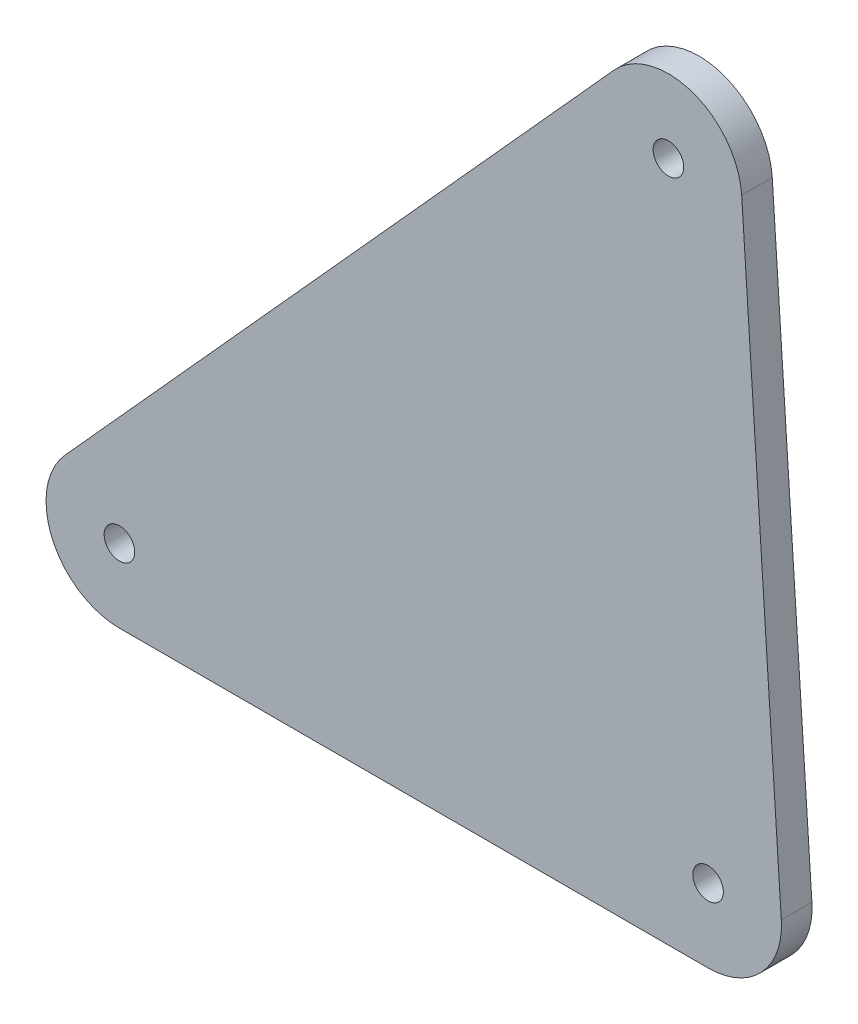
ISO-10303-21;
HEADER;
FILE_DESCRIPTION(('STEP AP214'),'2;1');
FILE_NAME('part.step','',(''),(''),'','','');
FILE_SCHEMA(('AUTOMOTIVE_DESIGN { 1 0 10303 214 1 1 1 1 }'));
ENDSEC;
DATA;
#1=APPLICATION_CONTEXT('core data for automotive mechanical design processes');
#2=APPLICATION_PROTOCOL_DEFINITION('international standard','automotive_design',2000,#1);
#3=PRODUCT_CONTEXT('',#1,'mechanical');
#4=PRODUCT('Part','Part','',(#3));
#5=PRODUCT_RELATED_PRODUCT_CATEGORY('part','',(#4));
#6=PRODUCT_DEFINITION_FORMATION('','',#4);
#7=PRODUCT_DEFINITION_CONTEXT('part definition',#1,'design');
#8=PRODUCT_DEFINITION('design','',#6,#7);
#9=PRODUCT_DEFINITION_SHAPE('','',#8);
#10=(LENGTH_UNIT() NAMED_UNIT(*) SI_UNIT(.MILLI.,.METRE.));
#11=(NAMED_UNIT(*) PLANE_ANGLE_UNIT() SI_UNIT($,.RADIAN.));
#12=(NAMED_UNIT(*) SI_UNIT($,.STERADIAN.) SOLID_ANGLE_UNIT());
#13=UNCERTAINTY_MEASURE_WITH_UNIT(LENGTH_MEASURE(1.E-05),#10,'distance_accuracy_value','');
#14=(GEOMETRIC_REPRESENTATION_CONTEXT(3) GLOBAL_UNCERTAINTY_ASSIGNED_CONTEXT((#13)) GLOBAL_UNIT_ASSIGNED_CONTEXT((#10,
#11,#12)) REPRESENTATION_CONTEXT('',''));
#15=CARTESIAN_POINT('',(0.,0.,0.));
#16=DIRECTION('',(0.,0.,1.));
#17=DIRECTION('',(1.,0.,0.));
#18=AXIS2_PLACEMENT_3D('',#15,#16,#17);
#19=CARTESIAN_POINT('',(96.2399998438047,-43.6944124892829,-23.206005243));
#20=DIRECTION('',(0.,0.,1.));
#21=DIRECTION('',(1.,0.,0.));
#22=AXIS2_PLACEMENT_3D('',#19,#20,#21);
#23=CYLINDRICAL_SURFACE('',#22,11.9999999885387);
#24=CARTESIAN_POINT('',(96.2399998438047,-43.6944124892829,-18.206005243));
#25=DIRECTION('',(0.,0.,1.));
#26=DIRECTION('',(1.,0.,0.));
#27=AXIS2_PLACEMENT_3D('',#24,#25,#26);
#28=CIRCLE('',#27,11.9999999885387);
#29=CARTESIAN_POINT('',(96.2399998438047,-55.6944124778216,-18.206005243));
#30=VERTEX_POINT('',#29);
#31=CARTESIAN_POINT('',(108.214557081093,-42.9134011604004,-18.206005243));
#32=VERTEX_POINT('',#31);
#33=EDGE_CURVE('E130',#30,#32,#28,.T.);
#34=ORIENTED_EDGE('',*,*,#33,.F.);
#35=DIRECTION('',(0.,0.,1.));
#36=VECTOR('',#35,1.);
#37=CARTESIAN_POINT('',(96.2399998438047,-55.6944124778216,-23.206005243));
#38=LINE('',#37,#36);
#39=CARTESIAN_POINT('',(96.2399998438047,-55.6944124778216,-23.206005243));
#40=VERTEX_POINT('',#39);
#41=EDGE_CURVE('E11',#40,#30,#38,.T.);
#42=ORIENTED_EDGE('',*,*,#41,.F.);
#43=CARTESIAN_POINT('',(96.2399998438047,-43.6944124892829,-23.206005243));
#44=DIRECTION('',(0.,0.,1.));
#45=DIRECTION('',(1.,0.,0.));
#46=AXIS2_PLACEMENT_3D('',#43,#44,#45);
#47=CIRCLE('',#46,11.9999999885387);
#48=CARTESIAN_POINT('',(108.214557081093,-42.9134011604004,-23.206005243));
#49=VERTEX_POINT('',#48);
#50=EDGE_CURVE('E151',#40,#49,#47,.T.);
#51=ORIENTED_EDGE('',*,*,#50,.T.);
#52=DIRECTION('',(0.,0.,1.));
#53=VECTOR('',#52,1.);
#54=CARTESIAN_POINT('',(108.214557081093,-42.9134011604004,-23.206005243));
#55=LINE('',#54,#53);
#56=EDGE_CURVE('E42',#49,#32,#55,.T.);
#57=ORIENTED_EDGE('',*,*,#56,.T.);
#58=EDGE_LOOP('',(#34,#42,#51,#57));
#59=FACE_BOUND('',#58,.T.);
#60=ADVANCED_FACE('F39',(#59),#23,.T.);
#61=CARTESIAN_POINT('',(0.,-55.6944124778216,-23.206005243));
#62=DIRECTION('',(0.,-1.,0.));
#63=DIRECTION('',(1.,0.,0.));
#64=AXIS2_PLACEMENT_3D('',#61,#62,#63);
#65=PLANE('',#64);
#66=DIRECTION('',(1.,0.,0.));
#67=VECTOR('',#66,1.);
#68=CARTESIAN_POINT('',(0.,-55.6944124778216,-18.206005243));
#69=LINE('',#68,#67);
#70=CARTESIAN_POINT('',(0.,-55.6944124778216,-18.206005243));
#71=VERTEX_POINT('',#70);
#72=EDGE_CURVE('E148',#71,#30,#69,.T.);
#73=ORIENTED_EDGE('',*,*,#72,.F.);
#74=DIRECTION('',(0.,0.,1.));
#75=VECTOR('',#74,1.);
#76=CARTESIAN_POINT('',(0.,-55.6944124778216,-23.206005243));
#77=LINE('',#76,#75);
#78=CARTESIAN_POINT('',(0.,-55.6944124778216,-23.206005243));
#79=VERTEX_POINT('',#78);
#80=EDGE_CURVE('E49',#79,#71,#77,.T.);
#81=ORIENTED_EDGE('',*,*,#80,.F.);
#82=DIRECTION('',(1.,0.,0.));
#83=VECTOR('',#82,1.);
#84=CARTESIAN_POINT('',(0.,-55.6944124778216,-23.206005243));
#85=LINE('',#84,#83);
#86=EDGE_CURVE('E116',#79,#40,#85,.T.);
#87=ORIENTED_EDGE('',*,*,#86,.T.);
#88=ORIENTED_EDGE('',*,*,#41,.T.);
#89=EDGE_LOOP('',(#73,#81,#87,#88));
#90=FACE_BOUND('',#89,.T.);
#91=ADVANCED_FACE('F163',(#90),#65,.T.);
#92=CARTESIAN_POINT('',(0.,-43.6944124817445,-23.206005243));
#93=DIRECTION('',(0.,0.,1.));
#94=DIRECTION('',(1.,0.,0.));
#95=AXIS2_PLACEMENT_3D('',#92,#93,#94);
#96=CYLINDRICAL_SURFACE('',#95,11.9999999960771);
#97=CARTESIAN_POINT('',(0.,-43.6944124817445,-18.206005243));
#98=DIRECTION('',(0.,0.,1.));
#99=DIRECTION('',(1.,0.,0.));
#100=AXIS2_PLACEMENT_3D('',#97,#98,#99);
#101=CIRCLE('',#100,11.9999999960771);
#102=CARTESIAN_POINT('',(-8.90580870191353,-35.6516162471771,-18.206005243));
#103=VERTEX_POINT('',#102);
#104=EDGE_CURVE('E102',#103,#71,#101,.T.);
#105=ORIENTED_EDGE('',*,*,#104,.F.);
#106=DIRECTION('',(0.,0.,1.));
#107=VECTOR('',#106,1.);
#108=CARTESIAN_POINT('',(-8.90580870191353,-35.6516162471771,-23.206005243));
#109=LINE('',#108,#107);
#110=CARTESIAN_POINT('',(-8.90580870191353,-35.6516162471771,-23.206005243));
#111=VERTEX_POINT('',#110);
#112=EDGE_CURVE('E97',#111,#103,#109,.T.);
#113=ORIENTED_EDGE('',*,*,#112,.F.);
#114=CARTESIAN_POINT('',(0.,-43.6944124817445,-23.206005243));
#115=DIRECTION('',(0.,0.,1.));
#116=DIRECTION('',(1.,0.,0.));
#117=AXIS2_PLACEMENT_3D('',#114,#115,#116);
#118=CIRCLE('',#117,11.9999999960771);
#119=EDGE_CURVE('E100',#111,#79,#118,.T.);
#120=ORIENTED_EDGE('',*,*,#119,.T.);
#121=ORIENTED_EDGE('',*,*,#80,.T.);
#122=EDGE_LOOP('',(#105,#113,#120,#121));
#123=FACE_BOUND('',#122,.T.);
#124=ADVANCED_FACE('F99',(#123),#96,.T.);
#125=CARTESIAN_POINT('',(80.8517971359318,63.7372087112362,-23.206005243));
#126=DIRECTION('',(-0.742150725402075,0.67023301976639,0.));
#127=DIRECTION('',(-0.67023301976639,-0.742150725402075,0.));
#128=AXIS2_PLACEMENT_3D('',#125,#126,#127);
#129=PLANE('',#128);
#130=DIRECTION('',(-0.67023301976639,-0.742150725402075,0.));
#131=VECTOR('',#130,1.);
#132=CARTESIAN_POINT('',(80.8517971359318,63.7372087112362,-18.206005243));
#133=LINE('',#132,#131);
#134=CARTESIAN_POINT('',(80.8517971359318,63.7372087112362,-18.206005243));
#135=VERTEX_POINT('',#134);
#136=EDGE_CURVE('E143',#135,#103,#133,.T.);
#137=ORIENTED_EDGE('',*,*,#136,.F.);
#138=DIRECTION('',(0.,0.,1.));
#139=VECTOR('',#138,1.);
#140=CARTESIAN_POINT('',(80.8517971359318,63.7372087112362,-23.206005243));
#141=LINE('',#140,#139);
#142=CARTESIAN_POINT('',(80.8517971359318,63.7372087112362,-23.206005243));
#143=VERTEX_POINT('',#142);
#144=EDGE_CURVE('E108',#143,#135,#141,.T.);
#145=ORIENTED_EDGE('',*,*,#144,.F.);
#146=DIRECTION('',(-0.67023301976639,-0.742150725402075,0.));
#147=VECTOR('',#146,1.);
#148=CARTESIAN_POINT('',(80.8517971359318,63.7372087112362,-23.206005243));
#149=LINE('',#148,#147);
#150=EDGE_CURVE('E114',#143,#111,#149,.T.);
#151=ORIENTED_EDGE('',*,*,#150,.T.);
#152=ORIENTED_EDGE('',*,*,#112,.T.);
#153=EDGE_LOOP('',(#137,#145,#151,#152));
#154=FACE_BOUND('',#153,.T.);
#155=ADVANCED_FACE('F119',(#154),#129,.T.);
#156=CARTESIAN_POINT('',(89.7576058271238,55.6944124863513,-23.206005243));
#157=DIRECTION('',(0.,0.,1.));
#158=DIRECTION('',(1.,0.,0.));
#159=AXIS2_PLACEMENT_3D('',#156,#157,#158);
#160=CYLINDRICAL_SURFACE('',#159,11.9999999816305);
#161=CARTESIAN_POINT('',(89.7576058271238,55.6944124863513,-18.206005243));
#162=DIRECTION('',(0.,0.,1.));
#163=DIRECTION('',(1.,0.,0.));
#164=AXIS2_PLACEMENT_3D('',#161,#162,#163);
#165=CIRCLE('',#164,11.9999999816305);
#166=CARTESIAN_POINT('',(101.732163057518,56.4754238147843,-18.206005243));
#167=VERTEX_POINT('',#166);
#168=EDGE_CURVE('E139',#167,#135,#165,.T.);
#169=ORIENTED_EDGE('',*,*,#168,.F.);
#170=DIRECTION('',(0.,0.,1.));
#171=VECTOR('',#170,1.);
#172=CARTESIAN_POINT('',(101.732163057518,56.4754238147843,-23.206005243));
#173=LINE('',#172,#171);
#174=CARTESIAN_POINT('',(101.732163057518,56.4754238147843,-23.206005243));
#175=VERTEX_POINT('',#174);
#176=EDGE_CURVE('E156',#175,#167,#173,.T.);
#177=ORIENTED_EDGE('',*,*,#176,.F.);
#178=CARTESIAN_POINT('',(89.7576058271238,55.6944124863513,-23.206005243));
#179=DIRECTION('',(0.,0.,1.));
#180=DIRECTION('',(1.,0.,0.));
#181=AXIS2_PLACEMENT_3D('',#178,#179,#180);
#182=CIRCLE('',#181,11.9999999816305);
#183=EDGE_CURVE('E121',#175,#143,#182,.T.);
#184=ORIENTED_EDGE('',*,*,#183,.T.);
#185=ORIENTED_EDGE('',*,*,#144,.T.);
#186=EDGE_LOOP('',(#169,#177,#184,#185));
#187=FACE_BOUND('',#186,.T.);
#188=ADVANCED_FACE('F176',(#187),#160,.T.);
#189=CARTESIAN_POINT('',(108.214557081093,-42.9134011604004,-23.206005243));
#190=DIRECTION('',(0.997879770727081,0.0650842774690432,0.));
#191=DIRECTION('',(-0.0650842774690432,0.997879770727081,0.));
#192=AXIS2_PLACEMENT_3D('',#189,#190,#191);
#193=PLANE('',#192);
#194=DIRECTION('',(-0.0650842774690432,0.997879770727081,0.));
#195=VECTOR('',#194,1.);
#196=CARTESIAN_POINT('',(108.214557081093,-42.9134011604004,-18.206005243));
#197=LINE('',#196,#195);
#198=EDGE_CURVE('E134',#32,#167,#197,.T.);
#199=ORIENTED_EDGE('',*,*,#198,.F.);
#200=ORIENTED_EDGE('',*,*,#56,.F.);
#201=DIRECTION('',(-0.0650842774690432,0.997879770727081,0.));
#202=VECTOR('',#201,1.);
#203=CARTESIAN_POINT('',(108.214557081093,-42.9134011604004,-23.206005243));
#204=LINE('',#203,#202);
#205=EDGE_CURVE('E124',#49,#175,#204,.T.);
#206=ORIENTED_EDGE('',*,*,#205,.T.);
#207=ORIENTED_EDGE('',*,*,#176,.T.);
#208=EDGE_LOOP('',(#199,#200,#206,#207));
#209=FACE_BOUND('',#208,.T.);
#210=ADVANCED_FACE('F160',(#209),#193,.T.);
#211=CARTESIAN_POINT('',(96.2399998438047,-43.6944124892829,-23.206005243));
#212=DIRECTION('',(0.,0.,1.));
#213=DIRECTION('',(1.,0.,0.));
#214=AXIS2_PLACEMENT_3D('',#211,#212,#213);
#215=PLANE('',#214);
#216=CARTESIAN_POINT('',(0.,-43.6944124817445,-23.206005243));
#217=DIRECTION('',(0.,0.,1.));
#218=DIRECTION('',(-1.,0.,0.));
#219=AXIS2_PLACEMENT_3D('',#216,#217,#218);
#220=CIRCLE('',#219,2.5);
#221=CARTESIAN_POINT('',(-2.5,-43.6944124817445,-23.206005243));
#222=VERTEX_POINT('',#221);
#223=EDGE_CURVE('E206',#222,#222,#220,.T.);
#224=ORIENTED_EDGE('',*,*,#223,.T.);
#225=EDGE_LOOP('',(#224));
#226=FACE_BOUND('',#225,.T.);
#227=CARTESIAN_POINT('',(96.2399998438047,-43.6944124892829,-23.206005243));
#228=DIRECTION('',(0.,0.,1.));
#229=DIRECTION('',(-1.,0.,0.));
#230=AXIS2_PLACEMENT_3D('',#227,#228,#229);
#231=CIRCLE('',#230,2.50000000000001);
#232=CARTESIAN_POINT('',(93.7399998438047,-43.6944124892829,-23.206005243));
#233=VERTEX_POINT('',#232);
#234=EDGE_CURVE('E216',#233,#233,#231,.T.);
#235=ORIENTED_EDGE('',*,*,#234,.T.);
#236=EDGE_LOOP('',(#235));
#237=FACE_BOUND('',#236,.T.);
#238=CARTESIAN_POINT('',(89.7576058271238,55.6944124863513,-23.206005243));
#239=DIRECTION('',(0.,0.,1.));
#240=DIRECTION('',(-1.,0.,0.));
#241=AXIS2_PLACEMENT_3D('',#238,#239,#240);
#242=CIRCLE('',#241,2.50000000000001);
#243=CARTESIAN_POINT('',(87.2576058271237,55.6944124863513,-23.206005243));
#244=VERTEX_POINT('',#243);
#245=EDGE_CURVE('E135',#244,#244,#242,.T.);
#246=ORIENTED_EDGE('',*,*,#245,.T.);
#247=EDGE_LOOP('',(#246));
#248=FACE_BOUND('',#247,.T.);
#249=ORIENTED_EDGE('',*,*,#50,.F.);
#250=ORIENTED_EDGE('',*,*,#86,.F.);
#251=ORIENTED_EDGE('',*,*,#119,.F.);
#252=ORIENTED_EDGE('',*,*,#150,.F.);
#253=ORIENTED_EDGE('',*,*,#183,.F.);
#254=ORIENTED_EDGE('',*,*,#205,.F.);
#255=EDGE_LOOP('',(#249,#250,#251,#252,#253,#254));
#256=FACE_BOUND('',#255,.T.);
#257=ADVANCED_FACE('F112',(#226,#237,#248,#256),#215,.F.);
#258=CARTESIAN_POINT('',(96.2399998438047,-43.6944124892829,-18.206005243));
#259=DIRECTION('',(0.,0.,1.));
#260=DIRECTION('',(1.,0.,0.));
#261=AXIS2_PLACEMENT_3D('',#258,#259,#260);
#262=PLANE('',#261);
#263=CARTESIAN_POINT('',(0.,-43.6944124817445,-18.206005243));
#264=DIRECTION('',(0.,0.,1.));
#265=DIRECTION('',(-1.,0.,0.));
#266=AXIS2_PLACEMENT_3D('',#263,#264,#265);
#267=CIRCLE('',#266,2.5);
#268=CARTESIAN_POINT('',(-2.5,-43.6944124817445,-18.206005243));
#269=VERTEX_POINT('',#268);
#270=EDGE_CURVE('E209',#269,#269,#267,.T.);
#271=ORIENTED_EDGE('',*,*,#270,.F.);
#272=EDGE_LOOP('',(#271));
#273=FACE_BOUND('',#272,.T.);
#274=CARTESIAN_POINT('',(96.2399998438047,-43.6944124892829,-18.206005243));
#275=DIRECTION('',(0.,0.,1.));
#276=DIRECTION('',(-1.,0.,0.));
#277=AXIS2_PLACEMENT_3D('',#274,#275,#276);
#278=CIRCLE('',#277,2.50000000000001);
#279=CARTESIAN_POINT('',(93.7399998438047,-43.6944124892829,-18.206005243));
#280=VERTEX_POINT('',#279);
#281=EDGE_CURVE('E213',#280,#280,#278,.T.);
#282=ORIENTED_EDGE('',*,*,#281,.F.);
#283=EDGE_LOOP('',(#282));
#284=FACE_BOUND('',#283,.T.);
#285=CARTESIAN_POINT('',(89.7576058271238,55.6944124863513,-18.206005243));
#286=DIRECTION('',(0.,0.,1.));
#287=DIRECTION('',(-1.,0.,0.));
#288=AXIS2_PLACEMENT_3D('',#285,#286,#287);
#289=CIRCLE('',#288,2.50000000000001);
#290=CARTESIAN_POINT('',(87.2576058271237,55.6944124863513,-18.206005243));
#291=VERTEX_POINT('',#290);
#292=EDGE_CURVE('E220',#291,#291,#289,.T.);
#293=ORIENTED_EDGE('',*,*,#292,.F.);
#294=EDGE_LOOP('',(#293));
#295=FACE_BOUND('',#294,.T.);
#296=ORIENTED_EDGE('',*,*,#33,.T.);
#297=ORIENTED_EDGE('',*,*,#198,.T.);
#298=ORIENTED_EDGE('',*,*,#168,.T.);
#299=ORIENTED_EDGE('',*,*,#136,.T.);
#300=ORIENTED_EDGE('',*,*,#104,.T.);
#301=ORIENTED_EDGE('',*,*,#72,.T.);
#302=EDGE_LOOP('',(#296,#297,#298,#299,#300,#301));
#303=FACE_BOUND('',#302,.T.);
#304=ADVANCED_FACE('F162',(#273,#284,#295,#303),#262,.T.);
#305=CARTESIAN_POINT('',(89.7576058271238,55.6944124863513,-23.206005243));
#306=DIRECTION('',(0.,0.,1.));
#307=DIRECTION('',(1.,0.,0.));
#308=AXIS2_PLACEMENT_3D('',#305,#306,#307);
#309=CYLINDRICAL_SURFACE('',#308,2.50000000000001);
#310=ORIENTED_EDGE('',*,*,#245,.F.);
#311=EDGE_LOOP('',(#310));
#312=FACE_BOUND('',#311,.T.);
#313=ORIENTED_EDGE('',*,*,#292,.T.);
#314=EDGE_LOOP('',(#313));
#315=FACE_BOUND('',#314,.T.);
#316=ADVANCED_FACE('F187',(#312,#315),#309,.F.);
#317=CARTESIAN_POINT('',(96.2399998438047,-43.6944124892829,-23.206005243));
#318=DIRECTION('',(0.,0.,1.));
#319=DIRECTION('',(1.,0.,0.));
#320=AXIS2_PLACEMENT_3D('',#317,#318,#319);
#321=CYLINDRICAL_SURFACE('',#320,2.50000000000001);
#322=ORIENTED_EDGE('',*,*,#234,.F.);
#323=EDGE_LOOP('',(#322));
#324=FACE_BOUND('',#323,.T.);
#325=ORIENTED_EDGE('',*,*,#281,.T.);
#326=EDGE_LOOP('',(#325));
#327=FACE_BOUND('',#326,.T.);
#328=ADVANCED_FACE('F194',(#324,#327),#321,.F.);
#329=CARTESIAN_POINT('',(0.,-43.6944124817445,-23.206005243));
#330=DIRECTION('',(0.,0.,1.));
#331=DIRECTION('',(1.,0.,0.));
#332=AXIS2_PLACEMENT_3D('',#329,#330,#331);
#333=CYLINDRICAL_SURFACE('',#332,2.5);
#334=ORIENTED_EDGE('',*,*,#223,.F.);
#335=EDGE_LOOP('',(#334));
#336=FACE_BOUND('',#335,.T.);
#337=ORIENTED_EDGE('',*,*,#270,.T.);
#338=EDGE_LOOP('',(#337));
#339=FACE_BOUND('',#338,.T.);
#340=ADVANCED_FACE('F198',(#336,#339),#333,.F.);
#341=CLOSED_SHELL('',(#60,#91,#124,#155,#188,#210,#257,#304,#316,#328,#340));
#342=MANIFOLD_SOLID_BREP('B2',#341);
#343=ADVANCED_BREP_SHAPE_REPRESENTATION('',(#18,#342),#14);
#344=SHAPE_DEFINITION_REPRESENTATION(#9,#343);
ENDSEC;
END-ISO-10303-21;
